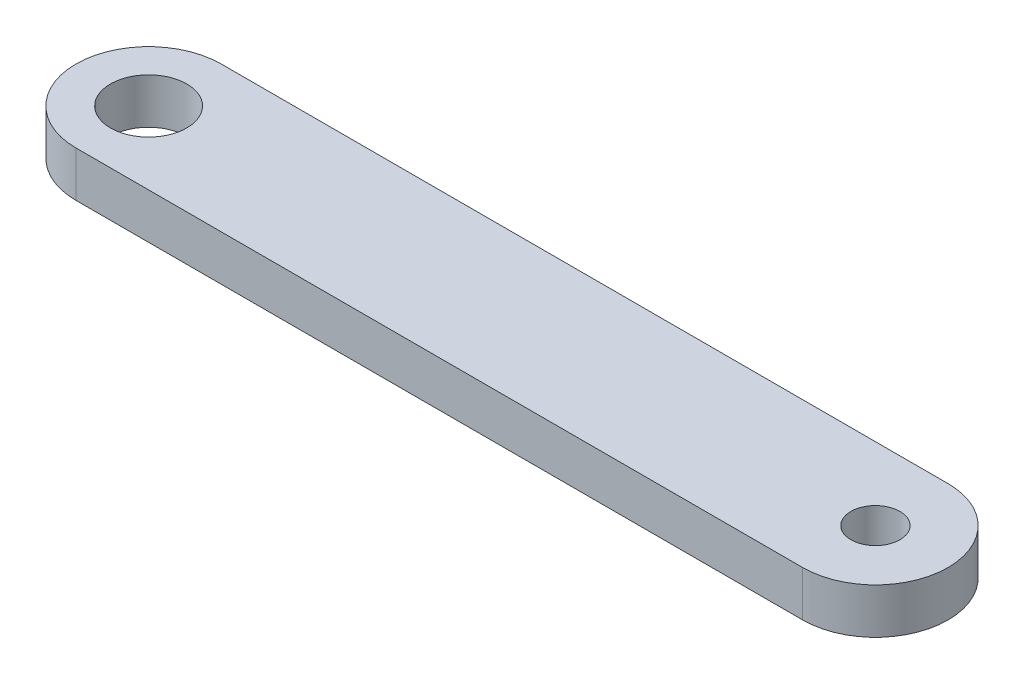
ISO-10303-21;
HEADER;
FILE_DESCRIPTION(('STEP AP214'),'2;1');
FILE_NAME('part.step','',(''),(''),'','','');
FILE_SCHEMA(('AUTOMOTIVE_DESIGN { 1 0 10303 214 1 1 1 1 }'));
ENDSEC;
DATA;
#1=APPLICATION_CONTEXT('core data for automotive mechanical design processes');
#2=APPLICATION_PROTOCOL_DEFINITION('international standard','automotive_design',2000,#1);
#3=PRODUCT_CONTEXT('',#1,'mechanical');
#4=PRODUCT('Part','Part','',(#3));
#5=PRODUCT_RELATED_PRODUCT_CATEGORY('part','',(#4));
#6=PRODUCT_DEFINITION_FORMATION('','',#4);
#7=PRODUCT_DEFINITION_CONTEXT('part definition',#1,'design');
#8=PRODUCT_DEFINITION('design','',#6,#7);
#9=PRODUCT_DEFINITION_SHAPE('','',#8);
#10=(LENGTH_UNIT() NAMED_UNIT(*) SI_UNIT(.MILLI.,.METRE.));
#11=(NAMED_UNIT(*) PLANE_ANGLE_UNIT() SI_UNIT($,.RADIAN.));
#12=(NAMED_UNIT(*) SI_UNIT($,.STERADIAN.) SOLID_ANGLE_UNIT());
#13=UNCERTAINTY_MEASURE_WITH_UNIT(LENGTH_MEASURE(1.E-05),#10,'distance_accuracy_value','');
#14=(GEOMETRIC_REPRESENTATION_CONTEXT(3) GLOBAL_UNCERTAINTY_ASSIGNED_CONTEXT((#13)) GLOBAL_UNIT_ASSIGNED_CONTEXT((#10,
#11,#12)) REPRESENTATION_CONTEXT('',''));
#15=CARTESIAN_POINT('',(0.,0.,0.));
#16=DIRECTION('',(0.,0.,1.));
#17=DIRECTION('',(1.,0.,0.));
#18=AXIS2_PLACEMENT_3D('',#15,#16,#17);
#19=CARTESIAN_POINT('',(0.,1.5875,0.));
#20=DIRECTION('',(0.,1.,0.));
#21=DIRECTION('',(0.,0.,1.));
#22=AXIS2_PLACEMENT_3D('',#19,#20,#21);
#23=PLANE('',#22);
#24=CARTESIAN_POINT('',(0.,1.5875,0.));
#25=DIRECTION('',(0.,1.,0.));
#26=DIRECTION('',(0.,0.,1.));
#27=AXIS2_PLACEMENT_3D('',#24,#25,#26);
#28=CIRCLE('',#27,2.667);
#29=CARTESIAN_POINT('',(0.,1.5875,2.667));
#30=VERTEX_POINT('',#29);
#31=EDGE_CURVE('E106',#30,#30,#28,.T.);
#32=ORIENTED_EDGE('',*,*,#31,.F.);
#33=EDGE_LOOP('',(#32));
#34=FACE_BOUND('',#33,.T.);
#35=CARTESIAN_POINT('',(0.,1.5875,0.));
#36=DIRECTION('',(0.,1.,0.));
#37=DIRECTION('',(0.,0.,1.));
#38=AXIS2_PLACEMENT_3D('',#35,#36,#37);
#39=CIRCLE('',#38,5.08);
#40=CARTESIAN_POINT('',(0.,1.5875,-5.08));
#41=VERTEX_POINT('',#40);
#42=CARTESIAN_POINT('',(0.,1.5875,5.08));
#43=VERTEX_POINT('',#42);
#44=EDGE_CURVE('E93',#41,#43,#39,.T.);
#45=ORIENTED_EDGE('',*,*,#44,.T.);
#46=DIRECTION('',(1.,0.,0.));
#47=VECTOR('',#46,1.);
#48=CARTESIAN_POINT('',(0.,1.5875,5.08));
#49=LINE('',#48,#47);
#50=CARTESIAN_POINT('',(50.8,1.5875,5.08));
#51=VERTEX_POINT('',#50);
#52=EDGE_CURVE('E88',#43,#51,#49,.T.);
#53=ORIENTED_EDGE('',*,*,#52,.T.);
#54=CARTESIAN_POINT('',(50.8,1.5875,0.));
#55=DIRECTION('',(0.,1.,0.));
#56=DIRECTION('',(0.,0.,1.));
#57=AXIS2_PLACEMENT_3D('',#54,#55,#56);
#58=CIRCLE('',#57,5.08);
#59=CARTESIAN_POINT('',(50.8,1.5875,-5.08));
#60=VERTEX_POINT('',#59);
#61=EDGE_CURVE('E90',#51,#60,#58,.T.);
#62=ORIENTED_EDGE('',*,*,#61,.T.);
#63=DIRECTION('',(-1.,0.,0.));
#64=VECTOR('',#63,1.);
#65=CARTESIAN_POINT('',(0.,1.5875,-5.08));
#66=LINE('',#65,#64);
#67=EDGE_CURVE('E57',#60,#41,#66,.T.);
#68=ORIENTED_EDGE('',*,*,#67,.T.);
#69=EDGE_LOOP('',(#45,#53,#62,#68));
#70=FACE_BOUND('',#69,.T.);
#71=CARTESIAN_POINT('',(50.8,1.5875,0.));
#72=DIRECTION('',(0.,1.,0.));
#73=DIRECTION('',(0.,0.,1.));
#74=AXIS2_PLACEMENT_3D('',#71,#72,#73);
#75=CIRCLE('',#74,1.7145);
#76=CARTESIAN_POINT('',(50.8,1.5875,1.7145));
#77=VERTEX_POINT('',#76);
#78=EDGE_CURVE('E122',#77,#77,#75,.T.);
#79=ORIENTED_EDGE('',*,*,#78,.F.);
#80=EDGE_LOOP('',(#79));
#81=FACE_BOUND('',#80,.T.);
#82=ADVANCED_FACE('F39',(#34,#70,#81),#23,.T.);
#83=CARTESIAN_POINT('',(0.,-1.5875,0.));
#84=DIRECTION('',(0.,1.,0.));
#85=DIRECTION('',(0.,0.,1.));
#86=AXIS2_PLACEMENT_3D('',#83,#84,#85);
#87=PLANE('',#86);
#88=CARTESIAN_POINT('',(0.,-1.5875,0.));
#89=DIRECTION('',(0.,1.,0.));
#90=DIRECTION('',(0.,0.,1.));
#91=AXIS2_PLACEMENT_3D('',#88,#89,#90);
#92=CIRCLE('',#91,5.08);
#93=CARTESIAN_POINT('',(0.,-1.5875,-5.08));
#94=VERTEX_POINT('',#93);
#95=CARTESIAN_POINT('',(0.,-1.5875,5.08));
#96=VERTEX_POINT('',#95);
#97=EDGE_CURVE('E103',#94,#96,#92,.T.);
#98=ORIENTED_EDGE('',*,*,#97,.F.);
#99=DIRECTION('',(-1.,0.,0.));
#100=VECTOR('',#99,1.);
#101=CARTESIAN_POINT('',(0.,-1.5875,-5.08));
#102=LINE('',#101,#100);
#103=CARTESIAN_POINT('',(50.8,-1.5875,-5.08));
#104=VERTEX_POINT('',#103);
#105=EDGE_CURVE('E76',#104,#94,#102,.T.);
#106=ORIENTED_EDGE('',*,*,#105,.F.);
#107=CARTESIAN_POINT('',(50.8,-1.5875,0.));
#108=DIRECTION('',(0.,1.,0.));
#109=DIRECTION('',(0.,0.,1.));
#110=AXIS2_PLACEMENT_3D('',#107,#108,#109);
#111=CIRCLE('',#110,5.08);
#112=CARTESIAN_POINT('',(50.8,-1.5875,5.08));
#113=VERTEX_POINT('',#112);
#114=EDGE_CURVE('E71',#113,#104,#111,.T.);
#115=ORIENTED_EDGE('',*,*,#114,.F.);
#116=DIRECTION('',(1.,0.,0.));
#117=VECTOR('',#116,1.);
#118=CARTESIAN_POINT('',(0.,-1.5875,5.08));
#119=LINE('',#118,#117);
#120=EDGE_CURVE('E92',#96,#113,#119,.T.);
#121=ORIENTED_EDGE('',*,*,#120,.F.);
#122=EDGE_LOOP('',(#98,#106,#115,#121));
#123=FACE_BOUND('',#122,.T.);
#124=CARTESIAN_POINT('',(0.,-1.5875,0.));
#125=DIRECTION('',(0.,1.,0.));
#126=DIRECTION('',(0.,0.,1.));
#127=AXIS2_PLACEMENT_3D('',#124,#125,#126);
#128=CIRCLE('',#127,2.667);
#129=CARTESIAN_POINT('',(0.,-1.5875,2.667));
#130=VERTEX_POINT('',#129);
#131=EDGE_CURVE('E119',#130,#130,#128,.T.);
#132=ORIENTED_EDGE('',*,*,#131,.T.);
#133=EDGE_LOOP('',(#132));
#134=FACE_BOUND('',#133,.T.);
#135=CARTESIAN_POINT('',(50.8,-1.5875,0.));
#136=DIRECTION('',(0.,1.,0.));
#137=DIRECTION('',(0.,0.,1.));
#138=AXIS2_PLACEMENT_3D('',#135,#136,#137);
#139=CIRCLE('',#138,1.7145);
#140=CARTESIAN_POINT('',(50.8,-1.5875,1.7145));
#141=VERTEX_POINT('',#140);
#142=EDGE_CURVE('E121',#141,#141,#139,.T.);
#143=ORIENTED_EDGE('',*,*,#142,.T.);
#144=EDGE_LOOP('',(#143));
#145=FACE_BOUND('',#144,.T.);
#146=ADVANCED_FACE('F111',(#123,#134,#145),#87,.F.);
#147=CARTESIAN_POINT('',(0.,1.5875,0.));
#148=DIRECTION('',(0.,-1.,0.));
#149=DIRECTION('',(0.,0.,-1.));
#150=AXIS2_PLACEMENT_3D('',#147,#148,#149);
#151=CYLINDRICAL_SURFACE('',#150,5.08);
#152=ORIENTED_EDGE('',*,*,#97,.T.);
#153=DIRECTION('',(0.,-1.,0.));
#154=VECTOR('',#153,1.);
#155=CARTESIAN_POINT('',(0.,1.5875,5.08));
#156=LINE('',#155,#154);
#157=EDGE_CURVE('E11',#43,#96,#156,.T.);
#158=ORIENTED_EDGE('',*,*,#157,.F.);
#159=ORIENTED_EDGE('',*,*,#44,.F.);
#160=DIRECTION('',(0.,-1.,0.));
#161=VECTOR('',#160,1.);
#162=CARTESIAN_POINT('',(0.,1.5875,-5.08));
#163=LINE('',#162,#161);
#164=EDGE_CURVE('E97',#41,#94,#163,.T.);
#165=ORIENTED_EDGE('',*,*,#164,.T.);
#166=EDGE_LOOP('',(#152,#158,#159,#165));
#167=FACE_BOUND('',#166,.T.);
#168=ADVANCED_FACE('F41',(#167),#151,.T.);
#169=CARTESIAN_POINT('',(0.,1.5875,5.08));
#170=DIRECTION('',(0.,0.,-1.));
#171=DIRECTION('',(-1.,0.,0.));
#172=AXIS2_PLACEMENT_3D('',#169,#170,#171);
#173=PLANE('',#172);
#174=ORIENTED_EDGE('',*,*,#120,.T.);
#175=DIRECTION('',(0.,-1.,0.));
#176=VECTOR('',#175,1.);
#177=CARTESIAN_POINT('',(50.8,1.5875,5.08));
#178=LINE('',#177,#176);
#179=EDGE_CURVE('E48',#51,#113,#178,.T.);
#180=ORIENTED_EDGE('',*,*,#179,.F.);
#181=ORIENTED_EDGE('',*,*,#52,.F.);
#182=ORIENTED_EDGE('',*,*,#157,.T.);
#183=EDGE_LOOP('',(#174,#180,#181,#182));
#184=FACE_BOUND('',#183,.T.);
#185=ADVANCED_FACE('F94',(#184),#173,.F.);
#186=CARTESIAN_POINT('',(50.8,1.5875,0.));
#187=DIRECTION('',(0.,-1.,0.));
#188=DIRECTION('',(0.,0.,-1.));
#189=AXIS2_PLACEMENT_3D('',#186,#187,#188);
#190=CYLINDRICAL_SURFACE('',#189,5.08);
#191=ORIENTED_EDGE('',*,*,#114,.T.);
#192=DIRECTION('',(0.,-1.,0.));
#193=VECTOR('',#192,1.);
#194=CARTESIAN_POINT('',(50.8,1.5875,-5.08));
#195=LINE('',#194,#193);
#196=EDGE_CURVE('E96',#60,#104,#195,.T.);
#197=ORIENTED_EDGE('',*,*,#196,.F.);
#198=ORIENTED_EDGE('',*,*,#61,.F.);
#199=ORIENTED_EDGE('',*,*,#179,.T.);
#200=EDGE_LOOP('',(#191,#197,#198,#199));
#201=FACE_BOUND('',#200,.T.);
#202=ADVANCED_FACE('F100',(#201),#190,.T.);
#203=CARTESIAN_POINT('',(0.,1.5875,-5.08));
#204=DIRECTION('',(0.,0.,1.));
#205=DIRECTION('',(1.,0.,0.));
#206=AXIS2_PLACEMENT_3D('',#203,#204,#205);
#207=PLANE('',#206);
#208=ORIENTED_EDGE('',*,*,#105,.T.);
#209=ORIENTED_EDGE('',*,*,#164,.F.);
#210=ORIENTED_EDGE('',*,*,#67,.F.);
#211=ORIENTED_EDGE('',*,*,#196,.T.);
#212=EDGE_LOOP('',(#208,#209,#210,#211));
#213=FACE_BOUND('',#212,.T.);
#214=ADVANCED_FACE('F112',(#213),#207,.F.);
#215=CARTESIAN_POINT('',(0.,1.5875,0.));
#216=DIRECTION('',(0.,-1.,0.));
#217=DIRECTION('',(0.,0.,-1.));
#218=AXIS2_PLACEMENT_3D('',#215,#216,#217);
#219=CYLINDRICAL_SURFACE('',#218,2.667);
#220=ORIENTED_EDGE('',*,*,#31,.T.);
#221=EDGE_LOOP('',(#220));
#222=FACE_BOUND('',#221,.T.);
#223=ORIENTED_EDGE('',*,*,#131,.F.);
#224=EDGE_LOOP('',(#223));
#225=FACE_BOUND('',#224,.T.);
#226=ADVANCED_FACE('F143',(#222,#225),#219,.F.);
#227=CARTESIAN_POINT('',(50.8,1.5875,0.));
#228=DIRECTION('',(0.,-1.,0.));
#229=DIRECTION('',(0.,0.,-1.));
#230=AXIS2_PLACEMENT_3D('',#227,#228,#229);
#231=CYLINDRICAL_SURFACE('',#230,1.7145);
#232=ORIENTED_EDGE('',*,*,#78,.T.);
#233=EDGE_LOOP('',(#232));
#234=FACE_BOUND('',#233,.T.);
#235=ORIENTED_EDGE('',*,*,#142,.F.);
#236=EDGE_LOOP('',(#235));
#237=FACE_BOUND('',#236,.T.);
#238=ADVANCED_FACE('F128',(#234,#237),#231,.F.);
#239=CLOSED_SHELL('',(#82,#146,#168,#185,#202,#214,#226,#238));
#240=MANIFOLD_SOLID_BREP('B2',#239);
#241=ADVANCED_BREP_SHAPE_REPRESENTATION('',(#18,#240),#14);
#242=SHAPE_DEFINITION_REPRESENTATION(#9,#241);
ENDSEC;
END-ISO-10303-21;
